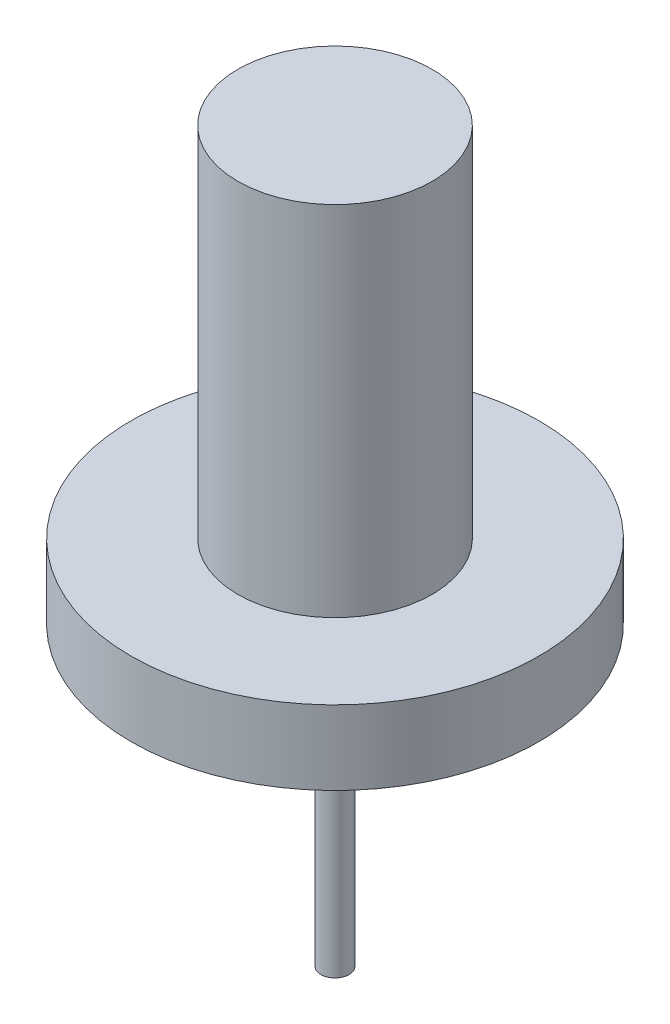
ISO-10303-21;
HEADER;
FILE_DESCRIPTION(('STEP AP214'),'2;1');
FILE_NAME('part.step','',(''),(''),'','','');
FILE_SCHEMA(('AUTOMOTIVE_DESIGN { 1 0 10303 214 1 1 1 1 }'));
ENDSEC;
DATA;
#1=APPLICATION_CONTEXT('core data for automotive mechanical design processes');
#2=APPLICATION_PROTOCOL_DEFINITION('international standard','automotive_design',2000,#1);
#3=PRODUCT_CONTEXT('',#1,'mechanical');
#4=PRODUCT('Part','Part','',(#3));
#5=PRODUCT_RELATED_PRODUCT_CATEGORY('part','',(#4));
#6=PRODUCT_DEFINITION_FORMATION('','',#4);
#7=PRODUCT_DEFINITION_CONTEXT('part definition',#1,'design');
#8=PRODUCT_DEFINITION('design','',#6,#7);
#9=PRODUCT_DEFINITION_SHAPE('','',#8);
#10=(LENGTH_UNIT() NAMED_UNIT(*) SI_UNIT(.MILLI.,.METRE.));
#11=(NAMED_UNIT(*) PLANE_ANGLE_UNIT() SI_UNIT($,.RADIAN.));
#12=(NAMED_UNIT(*) SI_UNIT($,.STERADIAN.) SOLID_ANGLE_UNIT());
#13=UNCERTAINTY_MEASURE_WITH_UNIT(LENGTH_MEASURE(1.E-05),#10,'distance_accuracy_value','');
#14=(GEOMETRIC_REPRESENTATION_CONTEXT(3) GLOBAL_UNCERTAINTY_ASSIGNED_CONTEXT((#13)) GLOBAL_UNIT_ASSIGNED_CONTEXT((#10,
#11,#12)) REPRESENTATION_CONTEXT('',''));
#15=CARTESIAN_POINT('',(0.,0.,0.));
#16=DIRECTION('',(0.,0.,1.));
#17=DIRECTION('',(1.,0.,0.));
#18=AXIS2_PLACEMENT_3D('',#15,#16,#17);
#19=CARTESIAN_POINT('',(0.,0.,0.));
#20=DIRECTION('',(0.,1.,0.));
#21=DIRECTION('',(0.,0.,1.));
#22=AXIS2_PLACEMENT_3D('',#19,#20,#21);
#23=PLANE('',#22);
#24=CARTESIAN_POINT('',(0.,0.,0.));
#25=DIRECTION('',(0.,1.,0.));
#26=DIRECTION('',(0.,0.,1.));
#27=AXIS2_PLACEMENT_3D('',#24,#25,#26);
#28=CIRCLE('',#27,34.925);
#29=CARTESIAN_POINT('',(0.,0.,34.925));
#30=VERTEX_POINT('',#29);
#31=EDGE_CURVE('E41',#30,#30,#28,.T.);
#32=ORIENTED_EDGE('',*,*,#31,.F.);
#33=EDGE_LOOP('',(#32));
#34=FACE_BOUND('',#33,.T.);
#35=CARTESIAN_POINT('',(0.,0.,0.));
#36=DIRECTION('',(0.,1.,0.));
#37=DIRECTION('',(0.,0.,1.));
#38=AXIS2_PLACEMENT_3D('',#35,#36,#37);
#39=CIRCLE('',#38,2.40792342956727);
#40=CARTESIAN_POINT('',(0.,0.,2.40792342956727));
#41=VERTEX_POINT('',#40);
#42=EDGE_CURVE('E10',#41,#41,#39,.F.);
#43=ORIENTED_EDGE('',*,*,#42,.F.);
#44=EDGE_LOOP('',(#43));
#45=FACE_BOUND('',#44,.T.);
#46=ADVANCED_FACE('F30',(#34,#45),#23,.F.);
#47=CARTESIAN_POINT('',(0.,12.7,0.));
#48=DIRECTION('',(0.,1.,0.));
#49=DIRECTION('',(0.,0.,1.));
#50=AXIS2_PLACEMENT_3D('',#47,#48,#49);
#51=PLANE('',#50);
#52=CARTESIAN_POINT('',(0.,12.7,0.));
#53=DIRECTION('',(0.,1.,0.));
#54=DIRECTION('',(0.,0.,1.));
#55=AXIS2_PLACEMENT_3D('',#52,#53,#54);
#56=CIRCLE('',#55,34.925);
#57=CARTESIAN_POINT('',(0.,12.7,34.925));
#58=VERTEX_POINT('',#57);
#59=EDGE_CURVE('E37',#58,#58,#56,.T.);
#60=ORIENTED_EDGE('',*,*,#59,.T.);
#61=EDGE_LOOP('',(#60));
#62=FACE_BOUND('',#61,.T.);
#63=CARTESIAN_POINT('',(0.,12.7,0.));
#64=DIRECTION('',(0.,1.,0.));
#65=DIRECTION('',(0.,0.,1.));
#66=AXIS2_PLACEMENT_3D('',#63,#64,#65);
#67=CIRCLE('',#66,16.637);
#68=CARTESIAN_POINT('',(0.,12.7,16.637));
#69=VERTEX_POINT('',#68);
#70=EDGE_CURVE('E48',#69,#69,#67,.T.);
#71=ORIENTED_EDGE('',*,*,#70,.F.);
#72=EDGE_LOOP('',(#71));
#73=FACE_BOUND('',#72,.T.);
#74=ADVANCED_FACE('F72',(#62,#73),#51,.T.);
#75=CARTESIAN_POINT('',(0.,12.7,0.));
#76=DIRECTION('',(0.,-1.,0.));
#77=DIRECTION('',(0.,0.,-1.));
#78=AXIS2_PLACEMENT_3D('',#75,#76,#77);
#79=CYLINDRICAL_SURFACE('',#78,34.925);
#80=ORIENTED_EDGE('',*,*,#59,.F.);
#81=EDGE_LOOP('',(#80));
#82=FACE_BOUND('',#81,.T.);
#83=ORIENTED_EDGE('',*,*,#31,.T.);
#84=EDGE_LOOP('',(#83));
#85=FACE_BOUND('',#84,.T.);
#86=ADVANCED_FACE('F32',(#82,#85),#79,.T.);
#87=CARTESIAN_POINT('',(0.,73.9648,0.));
#88=DIRECTION('',(0.,-1.,0.));
#89=DIRECTION('',(0.,0.,-1.));
#90=AXIS2_PLACEMENT_3D('',#87,#88,#89);
#91=CYLINDRICAL_SURFACE('',#90,16.637);
#92=CARTESIAN_POINT('',(0.,73.9648,0.));
#93=DIRECTION('',(0.,1.,0.));
#94=DIRECTION('',(0.,0.,1.));
#95=AXIS2_PLACEMENT_3D('',#92,#93,#94);
#96=CIRCLE('',#95,16.637);
#97=CARTESIAN_POINT('',(0.,73.9648,16.637));
#98=VERTEX_POINT('',#97);
#99=EDGE_CURVE('E46',#98,#98,#96,.T.);
#100=ORIENTED_EDGE('',*,*,#99,.F.);
#101=EDGE_LOOP('',(#100));
#102=FACE_BOUND('',#101,.T.);
#103=ORIENTED_EDGE('',*,*,#70,.T.);
#104=EDGE_LOOP('',(#103));
#105=FACE_BOUND('',#104,.T.);
#106=ADVANCED_FACE('F68',(#102,#105),#91,.T.);
#107=CARTESIAN_POINT('',(0.,73.9648,0.));
#108=DIRECTION('',(0.,1.,0.));
#109=DIRECTION('',(0.,0.,1.));
#110=AXIS2_PLACEMENT_3D('',#107,#108,#109);
#111=PLANE('',#110);
#112=ORIENTED_EDGE('',*,*,#99,.T.);
#113=EDGE_LOOP('',(#112));
#114=FACE_BOUND('',#113,.T.);
#115=ADVANCED_FACE('F61',(#114),#111,.T.);
#116=CARTESIAN_POINT('',(0.,-50.8,0.));
#117=DIRECTION('',(0.,1.,0.));
#118=DIRECTION('',(0.,0.,1.));
#119=AXIS2_PLACEMENT_3D('',#116,#117,#118);
#120=CYLINDRICAL_SURFACE('',#119,2.40792342956727);
#121=CARTESIAN_POINT('',(0.,-50.8,0.));
#122=DIRECTION('',(0.,-1.,0.));
#123=DIRECTION('',(0.,0.,-1.));
#124=AXIS2_PLACEMENT_3D('',#121,#122,#123);
#125=CIRCLE('',#124,2.40792342956727);
#126=CARTESIAN_POINT('',(0.,-50.8,-2.40792342956727));
#127=VERTEX_POINT('',#126);
#128=EDGE_CURVE('E51',#127,#127,#125,.T.);
#129=ORIENTED_EDGE('',*,*,#128,.F.);
#130=EDGE_LOOP('',(#129));
#131=FACE_BOUND('',#130,.T.);
#132=ORIENTED_EDGE('',*,*,#42,.T.);
#133=EDGE_LOOP('',(#132));
#134=FACE_BOUND('',#133,.T.);
#135=ADVANCED_FACE('F59',(#131,#134),#120,.T.);
#136=CARTESIAN_POINT('',(0.,-50.8,0.));
#137=DIRECTION('',(0.,-1.,0.));
#138=DIRECTION('',(0.,0.,-1.));
#139=AXIS2_PLACEMENT_3D('',#136,#137,#138);
#140=PLANE('',#139);
#141=ORIENTED_EDGE('',*,*,#128,.T.);
#142=EDGE_LOOP('',(#141));
#143=FACE_BOUND('',#142,.T.);
#144=ADVANCED_FACE('F57',(#143),#140,.T.);
#145=CLOSED_SHELL('',(#46,#74,#86,#106,#115,#135,#144));
#146=MANIFOLD_SOLID_BREP('B2',#145);
#147=ADVANCED_BREP_SHAPE_REPRESENTATION('',(#18,#146),#14);
#148=SHAPE_DEFINITION_REPRESENTATION(#9,#147);
ENDSEC;
END-ISO-10303-21;
